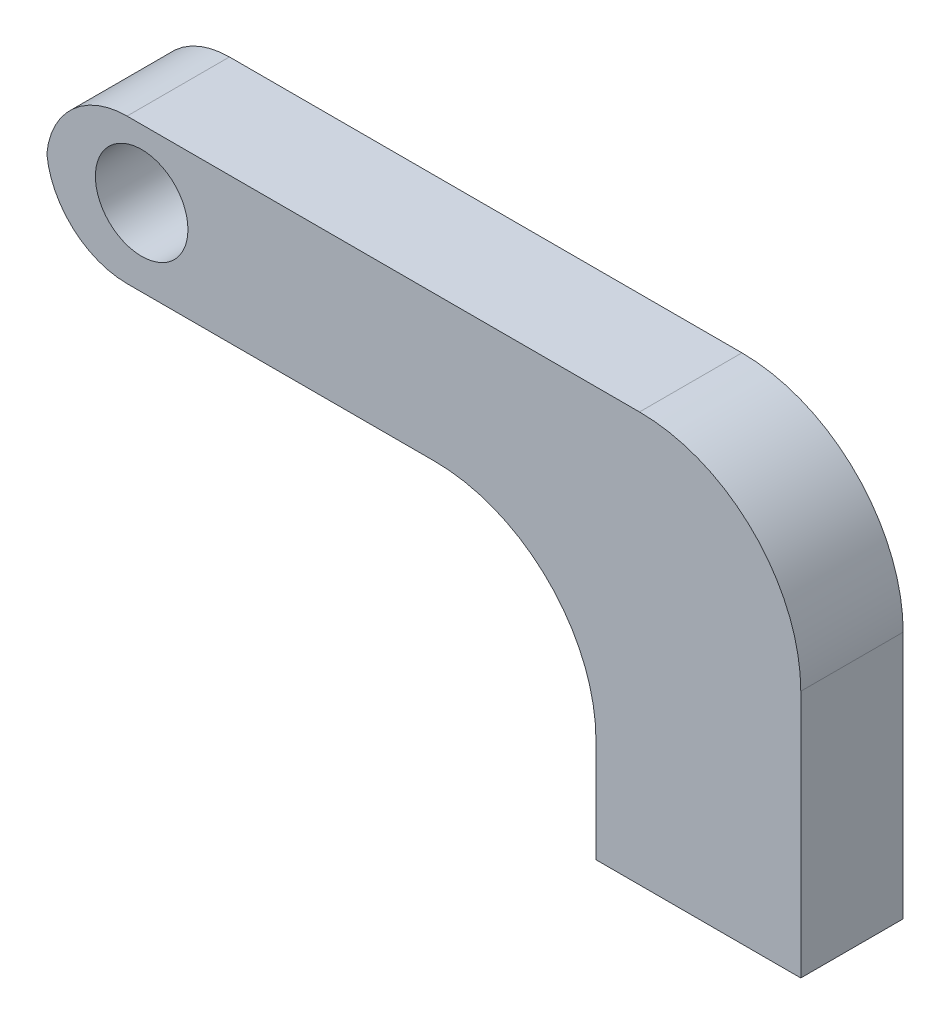
ISO-10303-21;
HEADER;
FILE_DESCRIPTION(('STEP AP214'),'2;1');
FILE_NAME('part.step','',(''),(''),'','','');
FILE_SCHEMA(('AUTOMOTIVE_DESIGN { 1 0 10303 214 1 1 1 1 }'));
ENDSEC;
DATA;
#1=APPLICATION_CONTEXT('core data for automotive mechanical design processes');
#2=APPLICATION_PROTOCOL_DEFINITION('international standard','automotive_design',2000,#1);
#3=PRODUCT_CONTEXT('',#1,'mechanical');
#4=PRODUCT('Part','Part','',(#3));
#5=PRODUCT_RELATED_PRODUCT_CATEGORY('part','',(#4));
#6=PRODUCT_DEFINITION_FORMATION('','',#4);
#7=PRODUCT_DEFINITION_CONTEXT('part definition',#1,'design');
#8=PRODUCT_DEFINITION('design','',#6,#7);
#9=PRODUCT_DEFINITION_SHAPE('','',#8);
#10=(LENGTH_UNIT() NAMED_UNIT(*) SI_UNIT(.MILLI.,.METRE.));
#11=(NAMED_UNIT(*) PLANE_ANGLE_UNIT() SI_UNIT($,.RADIAN.));
#12=(NAMED_UNIT(*) SI_UNIT($,.STERADIAN.) SOLID_ANGLE_UNIT());
#13=UNCERTAINTY_MEASURE_WITH_UNIT(LENGTH_MEASURE(1.E-05),#10,'distance_accuracy_value','');
#14=(GEOMETRIC_REPRESENTATION_CONTEXT(3) GLOBAL_UNCERTAINTY_ASSIGNED_CONTEXT((#13)) GLOBAL_UNIT_ASSIGNED_CONTEXT((#10,
#11,#12)) REPRESENTATION_CONTEXT('',''));
#15=CARTESIAN_POINT('',(0.,0.,0.));
#16=DIRECTION('',(0.,0.,1.));
#17=DIRECTION('',(1.,0.,0.));
#18=AXIS2_PLACEMENT_3D('',#15,#16,#17);
#19=CARTESIAN_POINT('',(0.,0.,6.35));
#20=DIRECTION('',(0.,0.,-1.));
#21=DIRECTION('',(-1.,0.,0.));
#22=AXIS2_PLACEMENT_3D('',#19,#20,#21);
#23=PLANE('',#22);
#24=DIRECTION('',(-1.,0.,0.));
#25=VECTOR('',#24,1.);
#26=CARTESIAN_POINT('',(-59.481100473913,63.5,6.35));
#27=LINE('',#26,#25);
#28=CARTESIAN_POINT('',(-22.7,63.5,6.35));
#29=VERTEX_POINT('',#28);
#30=CARTESIAN_POINT('',(-54.481100473913,63.5,6.35));
#31=VERTEX_POINT('',#30);
#32=EDGE_CURVE('E173',#29,#31,#27,.T.);
#33=ORIENTED_EDGE('',*,*,#32,.T.);
#34=CARTESIAN_POINT('',(-54.481100473913,58.5,6.35));
#35=DIRECTION('',(0.,0.,-1.));
#36=DIRECTION('',(-1.,0.,0.));
#37=AXIS2_PLACEMENT_3D('',#34,#35,#36);
#38=CIRCLE('',#37,5.);
#39=CARTESIAN_POINT('',(-59.4560376594461,59.,6.35));
#40=VERTEX_POINT('',#39);
#41=EDGE_CURVE('E42',#31,#40,#38,.F.);
#42=ORIENTED_EDGE('',*,*,#41,.T.);
#43=CARTESIAN_POINT('',(-54.481100473913,59.5,6.35));
#44=DIRECTION('',(0.,0.,-1.));
#45=DIRECTION('',(-1.,0.,0.));
#46=AXIS2_PLACEMENT_3D('',#43,#44,#45);
#47=CIRCLE('',#46,5.);
#48=CARTESIAN_POINT('',(-54.481100473913,54.5,6.35));
#49=VERTEX_POINT('',#48);
#50=EDGE_CURVE('E52',#40,#49,#47,.F.);
#51=ORIENTED_EDGE('',*,*,#50,.T.);
#52=DIRECTION('',(1.,0.,0.));
#53=VECTOR('',#52,1.);
#54=CARTESIAN_POINT('',(-59.481100473913,54.5,6.35));
#55=LINE('',#54,#53);
#56=CARTESIAN_POINT('',(-35.4,54.5,6.35));
#57=VERTEX_POINT('',#56);
#58=EDGE_CURVE('E111',#49,#57,#55,.T.);
#59=ORIENTED_EDGE('',*,*,#58,.T.);
#60=CARTESIAN_POINT('',(-35.4,44.5,6.35));
#61=DIRECTION('',(0.,0.,-1.));
#62=DIRECTION('',(-1.,0.,0.));
#63=AXIS2_PLACEMENT_3D('',#60,#61,#62);
#64=CIRCLE('',#63,10.);
#65=CARTESIAN_POINT('',(-25.4,44.5,6.35));
#66=VERTEX_POINT('',#65);
#67=EDGE_CURVE('E107',#57,#66,#64,.T.);
#68=ORIENTED_EDGE('',*,*,#67,.T.);
#69=DIRECTION('',(0.,-1.,0.));
#70=VECTOR('',#69,1.);
#71=CARTESIAN_POINT('',(-25.4,54.5,6.35));
#72=LINE('',#71,#70);
#73=CARTESIAN_POINT('',(-25.4,38.1,6.35));
#74=VERTEX_POINT('',#73);
#75=EDGE_CURVE('E99',#66,#74,#72,.T.);
#76=ORIENTED_EDGE('',*,*,#75,.T.);
#77=DIRECTION('',(1.,0.,0.));
#78=VECTOR('',#77,1.);
#79=CARTESIAN_POINT('',(-12.7,38.1,6.35));
#80=LINE('',#79,#78);
#81=CARTESIAN_POINT('',(-12.7,38.1,6.35));
#82=VERTEX_POINT('',#81);
#83=EDGE_CURVE('E104',#74,#82,#80,.T.);
#84=ORIENTED_EDGE('',*,*,#83,.T.);
#85=DIRECTION('',(0.,1.,0.));
#86=VECTOR('',#85,1.);
#87=CARTESIAN_POINT('',(-12.7,38.1,6.35));
#88=LINE('',#87,#86);
#89=CARTESIAN_POINT('',(-12.7,53.5,6.35));
#90=VERTEX_POINT('',#89);
#91=EDGE_CURVE('E142',#82,#90,#88,.T.);
#92=ORIENTED_EDGE('',*,*,#91,.T.);
#93=CARTESIAN_POINT('',(-22.7,53.5,6.35));
#94=DIRECTION('',(0.,0.,-1.));
#95=DIRECTION('',(-1.,0.,0.));
#96=AXIS2_PLACEMENT_3D('',#93,#94,#95);
#97=CIRCLE('',#96,10.);
#98=EDGE_CURVE('E150',#90,#29,#97,.F.);
#99=ORIENTED_EDGE('',*,*,#98,.T.);
#100=EDGE_LOOP('',(#33,#42,#51,#59,#68,#76,#84,#92,#99));
#101=FACE_BOUND('',#100,.T.);
#102=CARTESIAN_POINT('',(-53.575,59.2899417882053,6.35));
#103=DIRECTION('',(0.,0.,1.));
#104=DIRECTION('',(1.,0.,0.));
#105=AXIS2_PLACEMENT_3D('',#102,#103,#104);
#106=CIRCLE('',#105,2.87019999999999);
#107=CARTESIAN_POINT('',(-50.7048,59.2899417882053,6.35));
#108=VERTEX_POINT('',#107);
#109=EDGE_CURVE('E135',#108,#108,#106,.T.);
#110=ORIENTED_EDGE('',*,*,#109,.F.);
#111=EDGE_LOOP('',(#110));
#112=FACE_BOUND('',#111,.T.);
#113=ADVANCED_FACE('F33',(#101,#112),#23,.F.);
#114=CARTESIAN_POINT('',(0.,0.,0.));
#115=DIRECTION('',(0.,0.,-1.));
#116=DIRECTION('',(-1.,0.,0.));
#117=AXIS2_PLACEMENT_3D('',#114,#115,#116);
#118=PLANE('',#117);
#119=CARTESIAN_POINT('',(-54.481100473913,59.5,0.));
#120=DIRECTION('',(0.,0.,-1.));
#121=DIRECTION('',(-1.,0.,0.));
#122=AXIS2_PLACEMENT_3D('',#119,#120,#121);
#123=CIRCLE('',#122,5.);
#124=CARTESIAN_POINT('',(-54.481100473913,54.5,0.));
#125=VERTEX_POINT('',#124);
#126=CARTESIAN_POINT('',(-59.4560376594461,59.,0.));
#127=VERTEX_POINT('',#126);
#128=EDGE_CURVE('E161',#125,#127,#123,.T.);
#129=ORIENTED_EDGE('',*,*,#128,.T.);
#130=CARTESIAN_POINT('',(-54.481100473913,58.5,0.));
#131=DIRECTION('',(0.,0.,-1.));
#132=DIRECTION('',(-1.,0.,0.));
#133=AXIS2_PLACEMENT_3D('',#130,#131,#132);
#134=CIRCLE('',#133,5.);
#135=CARTESIAN_POINT('',(-54.481100473913,63.5,0.));
#136=VERTEX_POINT('',#135);
#137=EDGE_CURVE('E163',#127,#136,#134,.T.);
#138=ORIENTED_EDGE('',*,*,#137,.T.);
#139=DIRECTION('',(-1.,0.,0.));
#140=VECTOR('',#139,1.);
#141=CARTESIAN_POINT('',(-59.481100473913,63.5,0.));
#142=LINE('',#141,#140);
#143=CARTESIAN_POINT('',(-22.7,63.5,0.));
#144=VERTEX_POINT('',#143);
#145=EDGE_CURVE('E134',#144,#136,#142,.T.);
#146=ORIENTED_EDGE('',*,*,#145,.F.);
#147=CARTESIAN_POINT('',(-22.7,53.5,0.));
#148=DIRECTION('',(0.,0.,-1.));
#149=DIRECTION('',(-1.,0.,0.));
#150=AXIS2_PLACEMENT_3D('',#147,#148,#149);
#151=CIRCLE('',#150,10.);
#152=CARTESIAN_POINT('',(-12.7,53.5,0.));
#153=VERTEX_POINT('',#152);
#154=EDGE_CURVE('E146',#144,#153,#151,.T.);
#155=ORIENTED_EDGE('',*,*,#154,.T.);
#156=DIRECTION('',(0.,1.,0.));
#157=VECTOR('',#156,1.);
#158=CARTESIAN_POINT('',(-12.7,63.5,0.));
#159=LINE('',#158,#157);
#160=CARTESIAN_POINT('',(-12.7,38.1,0.));
#161=VERTEX_POINT('',#160);
#162=EDGE_CURVE('E131',#161,#153,#159,.T.);
#163=ORIENTED_EDGE('',*,*,#162,.F.);
#164=DIRECTION('',(1.,0.,0.));
#165=VECTOR('',#164,1.);
#166=CARTESIAN_POINT('',(-12.7,38.1,0.));
#167=LINE('',#166,#165);
#168=CARTESIAN_POINT('',(-25.4,38.1,0.));
#169=VERTEX_POINT('',#168);
#170=EDGE_CURVE('E141',#169,#161,#167,.T.);
#171=ORIENTED_EDGE('',*,*,#170,.F.);
#172=DIRECTION('',(0.,-1.,0.));
#173=VECTOR('',#172,1.);
#174=CARTESIAN_POINT('',(-25.4,38.1,0.));
#175=LINE('',#174,#173);
#176=CARTESIAN_POINT('',(-25.4,44.5,0.));
#177=VERTEX_POINT('',#176);
#178=EDGE_CURVE('E117',#177,#169,#175,.T.);
#179=ORIENTED_EDGE('',*,*,#178,.F.);
#180=CARTESIAN_POINT('',(-35.4,44.5,0.));
#181=DIRECTION('',(0.,0.,-1.));
#182=DIRECTION('',(-1.,0.,0.));
#183=AXIS2_PLACEMENT_3D('',#180,#181,#182);
#184=CIRCLE('',#183,10.);
#185=CARTESIAN_POINT('',(-35.4,54.5,0.));
#186=VERTEX_POINT('',#185);
#187=EDGE_CURVE('E157',#177,#186,#184,.F.);
#188=ORIENTED_EDGE('',*,*,#187,.T.);
#189=DIRECTION('',(1.,0.,0.));
#190=VECTOR('',#189,1.);
#191=CARTESIAN_POINT('',(-59.481100473913,54.5,0.));
#192=LINE('',#191,#190);
#193=EDGE_CURVE('E138',#125,#186,#192,.T.);
#194=ORIENTED_EDGE('',*,*,#193,.F.);
#195=EDGE_LOOP('',(#129,#138,#146,#155,#163,#171,#179,#188,#194));
#196=FACE_BOUND('',#195,.T.);
#197=CARTESIAN_POINT('',(-53.575,59.2899417882053,0.));
#198=DIRECTION('',(0.,0.,1.));
#199=DIRECTION('',(1.,0.,0.));
#200=AXIS2_PLACEMENT_3D('',#197,#198,#199);
#201=CIRCLE('',#200,2.87019999999999);
#202=CARTESIAN_POINT('',(-50.7048,59.2899417882053,0.));
#203=VERTEX_POINT('',#202);
#204=EDGE_CURVE('E182',#203,#203,#201,.T.);
#205=ORIENTED_EDGE('',*,*,#204,.T.);
#206=EDGE_LOOP('',(#205));
#207=FACE_BOUND('',#206,.T.);
#208=ADVANCED_FACE('F191',(#196,#207),#118,.T.);
#209=CARTESIAN_POINT('',(-12.7,63.5,6.35));
#210=DIRECTION('',(-1.,0.,0.));
#211=DIRECTION('',(0.,0.,1.));
#212=AXIS2_PLACEMENT_3D('',#209,#210,#211);
#213=PLANE('',#212);
#214=ORIENTED_EDGE('',*,*,#162,.T.);
#215=DIRECTION('',(0.,0.,-1.));
#216=VECTOR('',#215,1.);
#217=CARTESIAN_POINT('',(-12.7,53.5,6.35));
#218=LINE('',#217,#216);
#219=EDGE_CURVE('E148',#153,#90,#218,.F.);
#220=ORIENTED_EDGE('',*,*,#219,.T.);
#221=ORIENTED_EDGE('',*,*,#91,.F.);
#222=DIRECTION('',(0.,0.,-1.));
#223=VECTOR('',#222,1.);
#224=CARTESIAN_POINT('',(-12.7,38.1,6.35));
#225=LINE('',#224,#223);
#226=EDGE_CURVE('E122',#82,#161,#225,.T.);
#227=ORIENTED_EDGE('',*,*,#226,.T.);
#228=EDGE_LOOP('',(#214,#220,#221,#227));
#229=FACE_BOUND('',#228,.T.);
#230=ADVANCED_FACE('F196',(#229),#213,.F.);
#231=CARTESIAN_POINT('',(-59.481100473913,63.5,6.35));
#232=DIRECTION('',(0.,-1.,0.));
#233=DIRECTION('',(0.,0.,-1.));
#234=AXIS2_PLACEMENT_3D('',#231,#232,#233);
#235=PLANE('',#234);
#236=ORIENTED_EDGE('',*,*,#145,.T.);
#237=DIRECTION('',(0.,0.,-1.));
#238=VECTOR('',#237,1.);
#239=CARTESIAN_POINT('',(-54.481100473913,63.5,6.35));
#240=LINE('',#239,#238);
#241=EDGE_CURVE('E165',#136,#31,#240,.F.);
#242=ORIENTED_EDGE('',*,*,#241,.T.);
#243=ORIENTED_EDGE('',*,*,#32,.F.);
#244=DIRECTION('',(0.,0.,-1.));
#245=VECTOR('',#244,1.);
#246=CARTESIAN_POINT('',(-22.7,63.5,6.35));
#247=LINE('',#246,#245);
#248=EDGE_CURVE('E121',#29,#144,#247,.T.);
#249=ORIENTED_EDGE('',*,*,#248,.T.);
#250=EDGE_LOOP('',(#236,#242,#243,#249));
#251=FACE_BOUND('',#250,.T.);
#252=ADVANCED_FACE('F172',(#251),#235,.F.);
#253=CARTESIAN_POINT('',(-59.481100473913,54.5,6.35));
#254=DIRECTION('',(0.,1.,0.));
#255=DIRECTION('',(0.,0.,1.));
#256=AXIS2_PLACEMENT_3D('',#253,#254,#255);
#257=PLANE('',#256);
#258=ORIENTED_EDGE('',*,*,#58,.F.);
#259=DIRECTION('',(0.,0.,-1.));
#260=VECTOR('',#259,1.);
#261=CARTESIAN_POINT('',(-54.481100473913,54.5,6.35));
#262=LINE('',#261,#260);
#263=EDGE_CURVE('E11',#49,#125,#262,.T.);
#264=ORIENTED_EDGE('',*,*,#263,.T.);
#265=ORIENTED_EDGE('',*,*,#193,.T.);
#266=DIRECTION('',(0.,0.,-1.));
#267=VECTOR('',#266,1.);
#268=CARTESIAN_POINT('',(-35.4,54.5,6.35));
#269=LINE('',#268,#267);
#270=EDGE_CURVE('E154',#186,#57,#269,.F.);
#271=ORIENTED_EDGE('',*,*,#270,.T.);
#272=EDGE_LOOP('',(#258,#264,#265,#271));
#273=FACE_BOUND('',#272,.T.);
#274=ADVANCED_FACE('F205',(#273),#257,.F.);
#275=CARTESIAN_POINT('',(-25.4,38.1,6.35));
#276=DIRECTION('',(1.,0.,0.));
#277=DIRECTION('',(0.,0.,-1.));
#278=AXIS2_PLACEMENT_3D('',#275,#276,#277);
#279=PLANE('',#278);
#280=ORIENTED_EDGE('',*,*,#75,.F.);
#281=DIRECTION('',(0.,0.,-1.));
#282=VECTOR('',#281,1.);
#283=CARTESIAN_POINT('',(-25.4,44.5,0.));
#284=LINE('',#283,#282);
#285=EDGE_CURVE('E152',#66,#177,#284,.T.);
#286=ORIENTED_EDGE('',*,*,#285,.T.);
#287=ORIENTED_EDGE('',*,*,#178,.T.);
#288=DIRECTION('',(0.,0.,-1.));
#289=VECTOR('',#288,1.);
#290=CARTESIAN_POINT('',(-25.4,38.1,6.35));
#291=LINE('',#290,#289);
#292=EDGE_CURVE('E114',#74,#169,#291,.T.);
#293=ORIENTED_EDGE('',*,*,#292,.F.);
#294=EDGE_LOOP('',(#280,#286,#287,#293));
#295=FACE_BOUND('',#294,.T.);
#296=ADVANCED_FACE('F115',(#295),#279,.F.);
#297=CARTESIAN_POINT('',(-12.7,38.1,6.35));
#298=DIRECTION('',(0.,1.,0.));
#299=DIRECTION('',(0.,0.,1.));
#300=AXIS2_PLACEMENT_3D('',#297,#298,#299);
#301=PLANE('',#300);
#302=ORIENTED_EDGE('',*,*,#170,.T.);
#303=ORIENTED_EDGE('',*,*,#226,.F.);
#304=ORIENTED_EDGE('',*,*,#83,.F.);
#305=ORIENTED_EDGE('',*,*,#292,.T.);
#306=EDGE_LOOP('',(#302,#303,#304,#305));
#307=FACE_BOUND('',#306,.T.);
#308=ADVANCED_FACE('F124',(#307),#301,.F.);
#309=CARTESIAN_POINT('',(-53.575,59.2899417882053,6.35));
#310=DIRECTION('',(0.,0.,-1.));
#311=DIRECTION('',(-1.,0.,0.));
#312=AXIS2_PLACEMENT_3D('',#309,#310,#311);
#313=CYLINDRICAL_SURFACE('',#312,2.87019999999999);
#314=ORIENTED_EDGE('',*,*,#109,.T.);
#315=EDGE_LOOP('',(#314));
#316=FACE_BOUND('',#315,.T.);
#317=ORIENTED_EDGE('',*,*,#204,.F.);
#318=EDGE_LOOP('',(#317));
#319=FACE_BOUND('',#318,.T.);
#320=ADVANCED_FACE('F188',(#316,#319),#313,.F.);
#321=CARTESIAN_POINT('',(-22.7,53.5,6.35));
#322=DIRECTION('',(0.,0.,-1.));
#323=DIRECTION('',(-1.,0.,0.));
#324=AXIS2_PLACEMENT_3D('',#321,#322,#323);
#325=CYLINDRICAL_SURFACE('',#324,10.);
#326=ORIENTED_EDGE('',*,*,#98,.F.);
#327=ORIENTED_EDGE('',*,*,#219,.F.);
#328=ORIENTED_EDGE('',*,*,#154,.F.);
#329=ORIENTED_EDGE('',*,*,#248,.F.);
#330=EDGE_LOOP('',(#326,#327,#328,#329));
#331=FACE_BOUND('',#330,.T.);
#332=ADVANCED_FACE('F214',(#331),#325,.T.);
#333=CARTESIAN_POINT('',(-35.4,44.5,6.35));
#334=DIRECTION('',(0.,0.,1.));
#335=DIRECTION('',(1.,0.,0.));
#336=AXIS2_PLACEMENT_3D('',#333,#334,#335);
#337=CYLINDRICAL_SURFACE('',#336,10.);
#338=ORIENTED_EDGE('',*,*,#67,.F.);
#339=ORIENTED_EDGE('',*,*,#270,.F.);
#340=ORIENTED_EDGE('',*,*,#187,.F.);
#341=ORIENTED_EDGE('',*,*,#285,.F.);
#342=EDGE_LOOP('',(#338,#339,#340,#341));
#343=FACE_BOUND('',#342,.T.);
#344=ADVANCED_FACE('F217',(#343),#337,.F.);
#345=CARTESIAN_POINT('',(-54.481100473913,59.5,6.35));
#346=DIRECTION('',(0.,0.,-1.));
#347=DIRECTION('',(-1.,0.,0.));
#348=AXIS2_PLACEMENT_3D('',#345,#346,#347);
#349=CYLINDRICAL_SURFACE('',#348,5.);
#350=ORIENTED_EDGE('',*,*,#263,.F.);
#351=ORIENTED_EDGE('',*,*,#50,.F.);
#352=DIRECTION('',(0.,0.,-1.));
#353=VECTOR('',#352,1.);
#354=CARTESIAN_POINT('',(-59.4560376594461,59.,3.175));
#355=LINE('',#354,#353);
#356=EDGE_CURVE('E37',#127,#40,#355,.F.);
#357=ORIENTED_EDGE('',*,*,#356,.F.);
#358=ORIENTED_EDGE('',*,*,#128,.F.);
#359=EDGE_LOOP('',(#350,#351,#357,#358));
#360=FACE_BOUND('',#359,.T.);
#361=ADVANCED_FACE('F35',(#360),#349,.T.);
#362=CARTESIAN_POINT('',(-54.481100473913,58.5,6.35));
#363=DIRECTION('',(0.,0.,-1.));
#364=DIRECTION('',(-1.,0.,0.));
#365=AXIS2_PLACEMENT_3D('',#362,#363,#364);
#366=CYLINDRICAL_SURFACE('',#365,5.);
#367=ORIENTED_EDGE('',*,*,#41,.F.);
#368=ORIENTED_EDGE('',*,*,#241,.F.);
#369=ORIENTED_EDGE('',*,*,#137,.F.);
#370=ORIENTED_EDGE('',*,*,#356,.T.);
#371=EDGE_LOOP('',(#367,#368,#369,#370));
#372=FACE_BOUND('',#371,.T.);
#373=ADVANCED_FACE('F221',(#372),#366,.T.);
#374=CLOSED_SHELL('',(#113,#208,#230,#252,#274,#296,#308,#320,#332,#344,#361,#373));
#375=MANIFOLD_SOLID_BREP('B2',#374);
#376=ADVANCED_BREP_SHAPE_REPRESENTATION('',(#18,#375),#14);
#377=SHAPE_DEFINITION_REPRESENTATION(#9,#376);
ENDSEC;
END-ISO-10303-21;
